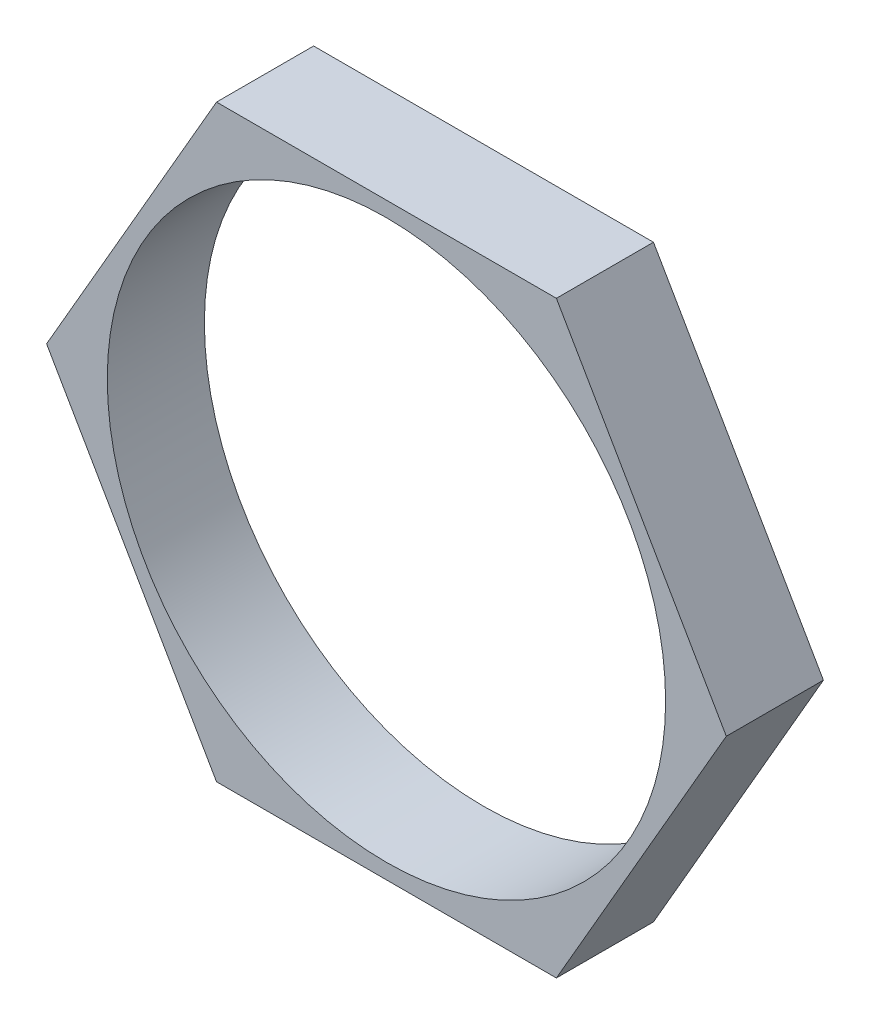
ISO-10303-21;
HEADER;
FILE_DESCRIPTION(('STEP AP214'),'2;1');
FILE_NAME('part.step','',(''),(''),'','','');
FILE_SCHEMA(('AUTOMOTIVE_DESIGN { 1 0 10303 214 1 1 1 1 }'));
ENDSEC;
DATA;
#1=APPLICATION_CONTEXT('core data for automotive mechanical design processes');
#2=APPLICATION_PROTOCOL_DEFINITION('international standard','automotive_design',2000,#1);
#3=PRODUCT_CONTEXT('',#1,'mechanical');
#4=PRODUCT('Part','Part','',(#3));
#5=PRODUCT_RELATED_PRODUCT_CATEGORY('part','',(#4));
#6=PRODUCT_DEFINITION_FORMATION('','',#4);
#7=PRODUCT_DEFINITION_CONTEXT('part definition',#1,'design');
#8=PRODUCT_DEFINITION('design','',#6,#7);
#9=PRODUCT_DEFINITION_SHAPE('','',#8);
#10=(LENGTH_UNIT() NAMED_UNIT(*) SI_UNIT(.MILLI.,.METRE.));
#11=(NAMED_UNIT(*) PLANE_ANGLE_UNIT() SI_UNIT($,.RADIAN.));
#12=(NAMED_UNIT(*) SI_UNIT($,.STERADIAN.) SOLID_ANGLE_UNIT());
#13=UNCERTAINTY_MEASURE_WITH_UNIT(LENGTH_MEASURE(1.E-05),#10,'distance_accuracy_value','');
#14=(GEOMETRIC_REPRESENTATION_CONTEXT(3) GLOBAL_UNCERTAINTY_ASSIGNED_CONTEXT((#13)) GLOBAL_UNIT_ASSIGNED_CONTEXT((#10,
#11,#12)) REPRESENTATION_CONTEXT('',''));
#15=CARTESIAN_POINT('',(0.,0.,0.));
#16=DIRECTION('',(0.,0.,1.));
#17=DIRECTION('',(1.,0.,0.));
#18=AXIS2_PLACEMENT_3D('',#15,#16,#17);
#19=CARTESIAN_POINT('',(0.,0.,2.));
#20=DIRECTION('',(0.,0.,1.));
#21=DIRECTION('',(1.,0.,0.));
#22=AXIS2_PLACEMENT_3D('',#19,#20,#21);
#23=PLANE('',#22);
#24=DIRECTION('',(0.5,0.866025403784439,0.));
#25=VECTOR('',#24,1.);
#26=CARTESIAN_POINT('',(3.5,-6.06217782649107,2.));
#27=LINE('',#26,#25);
#28=CARTESIAN_POINT('',(3.5,-6.06217782649107,2.));
#29=VERTEX_POINT('',#28);
#30=CARTESIAN_POINT('',(7.,0.,2.));
#31=VERTEX_POINT('',#30);
#32=EDGE_CURVE('E131',#29,#31,#27,.T.);
#33=ORIENTED_EDGE('',*,*,#32,.T.);
#34=DIRECTION('',(-0.5,0.866025403784439,0.));
#35=VECTOR('',#34,1.);
#36=CARTESIAN_POINT('',(7.,0.,2.));
#37=LINE('',#36,#35);
#38=CARTESIAN_POINT('',(3.5,6.06217782649107,2.));
#39=VERTEX_POINT('',#38);
#40=EDGE_CURVE('E89',#31,#39,#37,.T.);
#41=ORIENTED_EDGE('',*,*,#40,.T.);
#42=DIRECTION('',(-1.,0.,0.));
#43=VECTOR('',#42,1.);
#44=CARTESIAN_POINT('',(3.5,6.06217782649107,2.));
#45=LINE('',#44,#43);
#46=CARTESIAN_POINT('',(-3.5,6.06217782649108,2.));
#47=VERTEX_POINT('',#46);
#48=EDGE_CURVE('E102',#39,#47,#45,.T.);
#49=ORIENTED_EDGE('',*,*,#48,.T.);
#50=DIRECTION('',(-0.5,-0.866025403784439,0.));
#51=VECTOR('',#50,1.);
#52=CARTESIAN_POINT('',(-3.5,6.06217782649108,2.));
#53=LINE('',#52,#51);
#54=CARTESIAN_POINT('',(-7.,0.,2.));
#55=VERTEX_POINT('',#54);
#56=EDGE_CURVE('E96',#47,#55,#53,.T.);
#57=ORIENTED_EDGE('',*,*,#56,.T.);
#58=DIRECTION('',(0.5,-0.866025403784439,0.));
#59=VECTOR('',#58,1.);
#60=CARTESIAN_POINT('',(-7.,0.,2.));
#61=LINE('',#60,#59);
#62=CARTESIAN_POINT('',(-3.5,-6.06217782649107,2.));
#63=VERTEX_POINT('',#62);
#64=EDGE_CURVE('E100',#55,#63,#61,.T.);
#65=ORIENTED_EDGE('',*,*,#64,.T.);
#66=DIRECTION('',(1.,0.,0.));
#67=VECTOR('',#66,1.);
#68=CARTESIAN_POINT('',(-3.5,-6.06217782649107,2.));
#69=LINE('',#68,#67);
#70=EDGE_CURVE('E52',#63,#29,#69,.T.);
#71=ORIENTED_EDGE('',*,*,#70,.T.);
#72=EDGE_LOOP('',(#33,#41,#49,#57,#65,#71));
#73=FACE_BOUND('',#72,.T.);
#74=CARTESIAN_POINT('',(0.,0.,2.));
#75=DIRECTION('',(0.,0.,1.));
#76=DIRECTION('',(1.,0.,0.));
#77=AXIS2_PLACEMENT_3D('',#74,#75,#76);
#78=CIRCLE('',#77,5.75);
#79=CARTESIAN_POINT('',(5.75,0.,2.));
#80=VERTEX_POINT('',#79);
#81=EDGE_CURVE('E124',#80,#80,#78,.T.);
#82=ORIENTED_EDGE('',*,*,#81,.F.);
#83=EDGE_LOOP('',(#82));
#84=FACE_BOUND('',#83,.T.);
#85=ADVANCED_FACE('F35',(#73,#84),#23,.T.);
#86=CARTESIAN_POINT('',(0.,0.,0.));
#87=DIRECTION('',(0.,0.,1.));
#88=DIRECTION('',(1.,0.,0.));
#89=AXIS2_PLACEMENT_3D('',#86,#87,#88);
#90=PLANE('',#89);
#91=DIRECTION('',(0.5,0.866025403784439,0.));
#92=VECTOR('',#91,1.);
#93=CARTESIAN_POINT('',(3.5,-6.06217782649107,0.));
#94=LINE('',#93,#92);
#95=CARTESIAN_POINT('',(3.5,-6.06217782649107,0.));
#96=VERTEX_POINT('',#95);
#97=CARTESIAN_POINT('',(7.,0.,0.));
#98=VERTEX_POINT('',#97);
#99=EDGE_CURVE('E120',#96,#98,#94,.T.);
#100=ORIENTED_EDGE('',*,*,#99,.F.);
#101=DIRECTION('',(1.,0.,0.));
#102=VECTOR('',#101,1.);
#103=CARTESIAN_POINT('',(-3.5,-6.06217782649107,0.));
#104=LINE('',#103,#102);
#105=CARTESIAN_POINT('',(-3.5,-6.06217782649107,0.));
#106=VERTEX_POINT('',#105);
#107=EDGE_CURVE('E81',#106,#96,#104,.T.);
#108=ORIENTED_EDGE('',*,*,#107,.F.);
#109=DIRECTION('',(0.5,-0.866025403784439,0.));
#110=VECTOR('',#109,1.);
#111=CARTESIAN_POINT('',(-7.,0.,0.));
#112=LINE('',#111,#110);
#113=CARTESIAN_POINT('',(-7.,0.,0.));
#114=VERTEX_POINT('',#113);
#115=EDGE_CURVE('E75',#114,#106,#112,.T.);
#116=ORIENTED_EDGE('',*,*,#115,.F.);
#117=DIRECTION('',(-0.5,-0.866025403784439,0.));
#118=VECTOR('',#117,1.);
#119=CARTESIAN_POINT('',(-3.5,6.06217782649108,0.));
#120=LINE('',#119,#118);
#121=CARTESIAN_POINT('',(-3.5,6.06217782649108,0.));
#122=VERTEX_POINT('',#121);
#123=EDGE_CURVE('E110',#122,#114,#120,.T.);
#124=ORIENTED_EDGE('',*,*,#123,.F.);
#125=DIRECTION('',(-1.,0.,0.));
#126=VECTOR('',#125,1.);
#127=CARTESIAN_POINT('',(3.5,6.06217782649107,0.));
#128=LINE('',#127,#126);
#129=CARTESIAN_POINT('',(3.5,6.06217782649107,0.));
#130=VERTEX_POINT('',#129);
#131=EDGE_CURVE('E126',#130,#122,#128,.T.);
#132=ORIENTED_EDGE('',*,*,#131,.F.);
#133=DIRECTION('',(-0.5,0.866025403784439,0.));
#134=VECTOR('',#133,1.);
#135=CARTESIAN_POINT('',(7.,0.,0.));
#136=LINE('',#135,#134);
#137=EDGE_CURVE('E123',#98,#130,#136,.T.);
#138=ORIENTED_EDGE('',*,*,#137,.F.);
#139=EDGE_LOOP('',(#100,#108,#116,#124,#132,#138));
#140=FACE_BOUND('',#139,.T.);
#141=CARTESIAN_POINT('',(0.,0.,0.));
#142=DIRECTION('',(0.,0.,1.));
#143=DIRECTION('',(1.,0.,0.));
#144=AXIS2_PLACEMENT_3D('',#141,#142,#143);
#145=CIRCLE('',#144,5.75);
#146=CARTESIAN_POINT('',(5.75,0.,0.));
#147=VERTEX_POINT('',#146);
#148=EDGE_CURVE('E224',#147,#147,#145,.T.);
#149=ORIENTED_EDGE('',*,*,#148,.T.);
#150=EDGE_LOOP('',(#149));
#151=FACE_BOUND('',#150,.T.);
#152=ADVANCED_FACE('F140',(#140,#151),#90,.F.);
#153=CARTESIAN_POINT('',(3.5,-6.06217782649107,2.));
#154=DIRECTION('',(-0.866025403784439,0.5,0.));
#155=DIRECTION('',(-0.5,-0.866025403784439,0.));
#156=AXIS2_PLACEMENT_3D('',#153,#154,#155);
#157=PLANE('',#156);
#158=ORIENTED_EDGE('',*,*,#99,.T.);
#159=DIRECTION('',(0.,0.,-1.));
#160=VECTOR('',#159,1.);
#161=CARTESIAN_POINT('',(7.,0.,2.));
#162=LINE('',#161,#160);
#163=EDGE_CURVE('E11',#31,#98,#162,.T.);
#164=ORIENTED_EDGE('',*,*,#163,.F.);
#165=ORIENTED_EDGE('',*,*,#32,.F.);
#166=DIRECTION('',(0.,0.,-1.));
#167=VECTOR('',#166,1.);
#168=CARTESIAN_POINT('',(3.5,-6.06217782649107,2.));
#169=LINE('',#168,#167);
#170=EDGE_CURVE('E116',#29,#96,#169,.T.);
#171=ORIENTED_EDGE('',*,*,#170,.T.);
#172=EDGE_LOOP('',(#158,#164,#165,#171));
#173=FACE_BOUND('',#172,.T.);
#174=ADVANCED_FACE('F37',(#173),#157,.F.);
#175=CARTESIAN_POINT('',(7.,0.,2.));
#176=DIRECTION('',(-0.866025403784439,-0.5,0.));
#177=DIRECTION('',(0.5,-0.866025403784439,0.));
#178=AXIS2_PLACEMENT_3D('',#175,#176,#177);
#179=PLANE('',#178);
#180=ORIENTED_EDGE('',*,*,#137,.T.);
#181=DIRECTION('',(0.,0.,-1.));
#182=VECTOR('',#181,1.);
#183=CARTESIAN_POINT('',(3.5,6.06217782649107,2.));
#184=LINE('',#183,#182);
#185=EDGE_CURVE('E44',#39,#130,#184,.T.);
#186=ORIENTED_EDGE('',*,*,#185,.F.);
#187=ORIENTED_EDGE('',*,*,#40,.F.);
#188=ORIENTED_EDGE('',*,*,#163,.T.);
#189=EDGE_LOOP('',(#180,#186,#187,#188));
#190=FACE_BOUND('',#189,.T.);
#191=ADVANCED_FACE('F165',(#190),#179,.F.);
#192=CARTESIAN_POINT('',(3.5,6.06217782649107,2.));
#193=DIRECTION('',(0.,-1.,0.));
#194=DIRECTION('',(1.,0.,0.));
#195=AXIS2_PLACEMENT_3D('',#192,#193,#194);
#196=PLANE('',#195);
#197=ORIENTED_EDGE('',*,*,#131,.T.);
#198=DIRECTION('',(0.,0.,-1.));
#199=VECTOR('',#198,1.);
#200=CARTESIAN_POINT('',(-3.5,6.06217782649108,2.));
#201=LINE('',#200,#199);
#202=EDGE_CURVE('E111',#47,#122,#201,.T.);
#203=ORIENTED_EDGE('',*,*,#202,.F.);
#204=ORIENTED_EDGE('',*,*,#48,.F.);
#205=ORIENTED_EDGE('',*,*,#185,.T.);
#206=EDGE_LOOP('',(#197,#203,#204,#205));
#207=FACE_BOUND('',#206,.T.);
#208=ADVANCED_FACE('F137',(#207),#196,.F.);
#209=CARTESIAN_POINT('',(-3.5,6.06217782649108,2.));
#210=DIRECTION('',(0.866025403784439,-0.5,0.));
#211=DIRECTION('',(0.5,0.866025403784439,0.));
#212=AXIS2_PLACEMENT_3D('',#209,#210,#211);
#213=PLANE('',#212);
#214=ORIENTED_EDGE('',*,*,#123,.T.);
#215=DIRECTION('',(0.,0.,-1.));
#216=VECTOR('',#215,1.);
#217=CARTESIAN_POINT('',(-7.,0.,2.));
#218=LINE('',#217,#216);
#219=EDGE_CURVE('E107',#55,#114,#218,.T.);
#220=ORIENTED_EDGE('',*,*,#219,.F.);
#221=ORIENTED_EDGE('',*,*,#56,.F.);
#222=ORIENTED_EDGE('',*,*,#202,.T.);
#223=EDGE_LOOP('',(#214,#220,#221,#222));
#224=FACE_BOUND('',#223,.T.);
#225=ADVANCED_FACE('F108',(#224),#213,.F.);
#226=CARTESIAN_POINT('',(-7.,0.,2.));
#227=DIRECTION('',(0.866025403784439,0.5,0.));
#228=DIRECTION('',(-0.5,0.866025403784439,0.));
#229=AXIS2_PLACEMENT_3D('',#226,#227,#228);
#230=PLANE('',#229);
#231=ORIENTED_EDGE('',*,*,#115,.T.);
#232=DIRECTION('',(0.,0.,-1.));
#233=VECTOR('',#232,1.);
#234=CARTESIAN_POINT('',(-3.5,-6.06217782649107,2.));
#235=LINE('',#234,#233);
#236=EDGE_CURVE('E112',#63,#106,#235,.T.);
#237=ORIENTED_EDGE('',*,*,#236,.F.);
#238=ORIENTED_EDGE('',*,*,#64,.F.);
#239=ORIENTED_EDGE('',*,*,#219,.T.);
#240=EDGE_LOOP('',(#231,#237,#238,#239));
#241=FACE_BOUND('',#240,.T.);
#242=ADVANCED_FACE('F114',(#241),#230,.F.);
#243=CARTESIAN_POINT('',(-3.5,-6.06217782649107,2.));
#244=DIRECTION('',(0.,1.,0.));
#245=DIRECTION('',(-1.,0.,0.));
#246=AXIS2_PLACEMENT_3D('',#243,#244,#245);
#247=PLANE('',#246);
#248=ORIENTED_EDGE('',*,*,#107,.T.);
#249=ORIENTED_EDGE('',*,*,#170,.F.);
#250=ORIENTED_EDGE('',*,*,#70,.F.);
#251=ORIENTED_EDGE('',*,*,#236,.T.);
#252=EDGE_LOOP('',(#248,#249,#250,#251));
#253=FACE_BOUND('',#252,.T.);
#254=ADVANCED_FACE('F145',(#253),#247,.F.);
#255=CARTESIAN_POINT('',(0.,0.,2.));
#256=DIRECTION('',(0.,0.,-1.));
#257=DIRECTION('',(-1.,0.,0.));
#258=AXIS2_PLACEMENT_3D('',#255,#256,#257);
#259=CYLINDRICAL_SURFACE('',#258,5.75);
#260=ORIENTED_EDGE('',*,*,#81,.T.);
#261=EDGE_LOOP('',(#260));
#262=FACE_BOUND('',#261,.T.);
#263=ORIENTED_EDGE('',*,*,#148,.F.);
#264=EDGE_LOOP('',(#263));
#265=FACE_BOUND('',#264,.T.);
#266=ADVANCED_FACE('F147',(#262,#265),#259,.F.);
#267=CLOSED_SHELL('',(#85,#152,#174,#191,#208,#225,#242,#254,#266));
#268=MANIFOLD_SOLID_BREP('B2',#267);
#269=ADVANCED_BREP_SHAPE_REPRESENTATION('',(#18,#268),#14);
#270=SHAPE_DEFINITION_REPRESENTATION(#9,#269);
ENDSEC;
END-ISO-10303-21;
